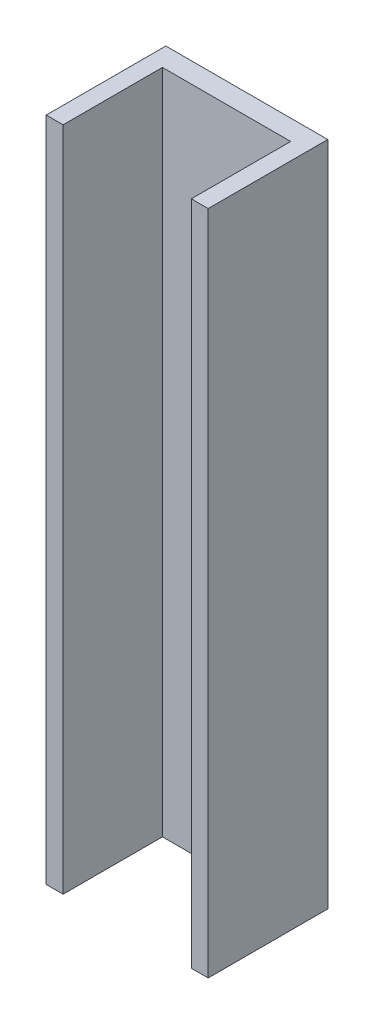
ISO-10303-21;
HEADER;
FILE_DESCRIPTION(('STEP AP214'),'2;1');
FILE_NAME('part.step','',(''),(''),'','','');
FILE_SCHEMA(('AUTOMOTIVE_DESIGN { 1 0 10303 214 1 1 1 1 }'));
ENDSEC;
DATA;
#1=APPLICATION_CONTEXT('core data for automotive mechanical design processes');
#2=APPLICATION_PROTOCOL_DEFINITION('international standard','automotive_design',2000,#1);
#3=PRODUCT_CONTEXT('',#1,'mechanical');
#4=PRODUCT('Part','Part','',(#3));
#5=PRODUCT_RELATED_PRODUCT_CATEGORY('part','',(#4));
#6=PRODUCT_DEFINITION_FORMATION('','',#4);
#7=PRODUCT_DEFINITION_CONTEXT('part definition',#1,'design');
#8=PRODUCT_DEFINITION('design','',#6,#7);
#9=PRODUCT_DEFINITION_SHAPE('','',#8);
#10=(LENGTH_UNIT() NAMED_UNIT(*) SI_UNIT(.MILLI.,.METRE.));
#11=(NAMED_UNIT(*) PLANE_ANGLE_UNIT() SI_UNIT($,.RADIAN.));
#12=(NAMED_UNIT(*) SI_UNIT($,.STERADIAN.) SOLID_ANGLE_UNIT());
#13=UNCERTAINTY_MEASURE_WITH_UNIT(LENGTH_MEASURE(1.E-05),#10,'distance_accuracy_value','');
#14=(GEOMETRIC_REPRESENTATION_CONTEXT(3) GLOBAL_UNCERTAINTY_ASSIGNED_CONTEXT((#13)) GLOBAL_UNIT_ASSIGNED_CONTEXT((#10,
#11,#12)) REPRESENTATION_CONTEXT('',''));
#15=CARTESIAN_POINT('',(0.,0.,0.));
#16=DIRECTION('',(0.,0.,1.));
#17=DIRECTION('',(1.,0.,0.));
#18=AXIS2_PLACEMENT_3D('',#15,#16,#17);
#19=CARTESIAN_POINT('',(3.8,39.5,5.89));
#20=DIRECTION('',(0.,0.,-1.));
#21=DIRECTION('',(-1.,0.,0.));
#22=AXIS2_PLACEMENT_3D('',#19,#20,#21);
#23=PLANE('',#22);
#24=DIRECTION('',(1.,0.,0.));
#25=VECTOR('',#24,1.);
#26=CARTESIAN_POINT('',(3.8,0.,5.89));
#27=LINE('',#26,#25);
#28=CARTESIAN_POINT('',(3.8,0.,5.89));
#29=VERTEX_POINT('',#28);
#30=CARTESIAN_POINT('',(4.8,0.,5.89));
#31=VERTEX_POINT('',#30);
#32=EDGE_CURVE('E147',#29,#31,#27,.T.);
#33=ORIENTED_EDGE('',*,*,#32,.T.);
#34=DIRECTION('',(0.,-1.,0.));
#35=VECTOR('',#34,1.);
#36=CARTESIAN_POINT('',(4.8,39.5,5.89));
#37=LINE('',#36,#35);
#38=CARTESIAN_POINT('',(4.8,39.5,5.89));
#39=VERTEX_POINT('',#38);
#40=EDGE_CURVE('E11',#39,#31,#37,.T.);
#41=ORIENTED_EDGE('',*,*,#40,.F.);
#42=DIRECTION('',(1.,0.,0.));
#43=VECTOR('',#42,1.);
#44=CARTESIAN_POINT('',(3.8,39.5,5.89));
#45=LINE('',#44,#43);
#46=CARTESIAN_POINT('',(3.8,39.5,5.89));
#47=VERTEX_POINT('',#46);
#48=EDGE_CURVE('E169',#47,#39,#45,.T.);
#49=ORIENTED_EDGE('',*,*,#48,.F.);
#50=DIRECTION('',(0.,-1.,0.));
#51=VECTOR('',#50,1.);
#52=CARTESIAN_POINT('',(3.8,39.5,5.89));
#53=LINE('',#52,#51);
#54=EDGE_CURVE('E143',#47,#29,#53,.T.);
#55=ORIENTED_EDGE('',*,*,#54,.T.);
#56=EDGE_LOOP('',(#33,#41,#49,#55));
#57=FACE_BOUND('',#56,.T.);
#58=ADVANCED_FACE('F45',(#57),#23,.F.);
#59=CARTESIAN_POINT('',(4.8,39.5,5.89));
#60=DIRECTION('',(-1.,0.,0.));
#61=DIRECTION('',(0.,0.,1.));
#62=AXIS2_PLACEMENT_3D('',#59,#60,#61);
#63=PLANE('',#62);
#64=DIRECTION('',(0.,0.,-1.));
#65=VECTOR('',#64,1.);
#66=CARTESIAN_POINT('',(4.8,0.,5.89));
#67=LINE('',#66,#65);
#68=CARTESIAN_POINT('',(4.8,0.,-1.2));
#69=VERTEX_POINT('',#68);
#70=EDGE_CURVE('E151',#31,#69,#67,.T.);
#71=ORIENTED_EDGE('',*,*,#70,.T.);
#72=DIRECTION('',(0.,-1.,0.));
#73=VECTOR('',#72,1.);
#74=CARTESIAN_POINT('',(4.8,39.5,-1.2));
#75=LINE('',#74,#73);
#76=CARTESIAN_POINT('',(4.8,39.5,-1.2));
#77=VERTEX_POINT('',#76);
#78=EDGE_CURVE('E55',#77,#69,#75,.T.);
#79=ORIENTED_EDGE('',*,*,#78,.F.);
#80=DIRECTION('',(0.,0.,-1.));
#81=VECTOR('',#80,1.);
#82=CARTESIAN_POINT('',(4.8,39.5,5.89));
#83=LINE('',#82,#81);
#84=EDGE_CURVE('E106',#39,#77,#83,.T.);
#85=ORIENTED_EDGE('',*,*,#84,.F.);
#86=ORIENTED_EDGE('',*,*,#40,.T.);
#87=EDGE_LOOP('',(#71,#79,#85,#86));
#88=FACE_BOUND('',#87,.T.);
#89=ADVANCED_FACE('F234',(#88),#63,.F.);
#90=CARTESIAN_POINT('',(4.8,39.5,-1.2));
#91=DIRECTION('',(0.,0.,1.));
#92=DIRECTION('',(1.,0.,0.));
#93=AXIS2_PLACEMENT_3D('',#90,#91,#92);
#94=PLANE('',#93);
#95=CARTESIAN_POINT('',(0.,19.75,-1.2));
#96=DIRECTION('',(0.,0.,-1.));
#97=DIRECTION('',(-1.,0.,0.));
#98=AXIS2_PLACEMENT_3D('',#95,#96,#97);
#99=CIRCLE('',#98,1.3375);
#100=CARTESIAN_POINT('',(-1.3375,19.75,-1.2));
#101=VERTEX_POINT('',#100);
#102=EDGE_CURVE('E214',#101,#101,#99,.T.);
#103=ORIENTED_EDGE('',*,*,#102,.F.);
#104=EDGE_LOOP('',(#103));
#105=FACE_BOUND('',#104,.T.);
#106=DIRECTION('',(-1.,0.,0.));
#107=VECTOR('',#106,1.);
#108=CARTESIAN_POINT('',(4.8,0.,-1.2));
#109=LINE('',#108,#107);
#110=CARTESIAN_POINT('',(-4.8,0.,-1.2));
#111=VERTEX_POINT('',#110);
#112=EDGE_CURVE('E154',#69,#111,#109,.T.);
#113=ORIENTED_EDGE('',*,*,#112,.T.);
#114=DIRECTION('',(0.,-1.,0.));
#115=VECTOR('',#114,1.);
#116=CARTESIAN_POINT('',(-4.8,39.5,-1.2));
#117=LINE('',#116,#115);
#118=CARTESIAN_POINT('',(-4.8,39.5,-1.2));
#119=VERTEX_POINT('',#118);
#120=EDGE_CURVE('E180',#119,#111,#117,.T.);
#121=ORIENTED_EDGE('',*,*,#120,.F.);
#122=DIRECTION('',(-1.,0.,0.));
#123=VECTOR('',#122,1.);
#124=CARTESIAN_POINT('',(4.8,39.5,-1.2));
#125=LINE('',#124,#123);
#126=EDGE_CURVE('E191',#77,#119,#125,.T.);
#127=ORIENTED_EDGE('',*,*,#126,.F.);
#128=ORIENTED_EDGE('',*,*,#78,.T.);
#129=EDGE_LOOP('',(#113,#121,#127,#128));
#130=FACE_BOUND('',#129,.T.);
#131=ADVANCED_FACE('F189',(#105,#130),#94,.F.);
#132=CARTESIAN_POINT('',(-4.8,39.5,-1.2));
#133=DIRECTION('',(1.,0.,0.));
#134=DIRECTION('',(0.,0.,-1.));
#135=AXIS2_PLACEMENT_3D('',#132,#133,#134);
#136=PLANE('',#135);
#137=DIRECTION('',(0.,0.,1.));
#138=VECTOR('',#137,1.);
#139=CARTESIAN_POINT('',(-4.8,0.,-1.2));
#140=LINE('',#139,#138);
#141=CARTESIAN_POINT('',(-4.8,0.,5.89));
#142=VERTEX_POINT('',#141);
#143=EDGE_CURVE('E157',#111,#142,#140,.T.);
#144=ORIENTED_EDGE('',*,*,#143,.T.);
#145=DIRECTION('',(0.,-1.,0.));
#146=VECTOR('',#145,1.);
#147=CARTESIAN_POINT('',(-4.8,39.5,5.89));
#148=LINE('',#147,#146);
#149=CARTESIAN_POINT('',(-4.8,39.5,5.89));
#150=VERTEX_POINT('',#149);
#151=EDGE_CURVE('E176',#150,#142,#148,.T.);
#152=ORIENTED_EDGE('',*,*,#151,.F.);
#153=DIRECTION('',(0.,0.,1.));
#154=VECTOR('',#153,1.);
#155=CARTESIAN_POINT('',(-4.8,39.5,-1.2));
#156=LINE('',#155,#154);
#157=EDGE_CURVE('E204',#119,#150,#156,.T.);
#158=ORIENTED_EDGE('',*,*,#157,.F.);
#159=ORIENTED_EDGE('',*,*,#120,.T.);
#160=EDGE_LOOP('',(#144,#152,#158,#159));
#161=FACE_BOUND('',#160,.T.);
#162=ADVANCED_FACE('F199',(#161),#136,.F.);
#163=CARTESIAN_POINT('',(-4.8,39.5,5.89));
#164=DIRECTION('',(0.,0.,-1.));
#165=DIRECTION('',(-1.,0.,0.));
#166=AXIS2_PLACEMENT_3D('',#163,#164,#165);
#167=PLANE('',#166);
#168=DIRECTION('',(1.,0.,0.));
#169=VECTOR('',#168,1.);
#170=CARTESIAN_POINT('',(-4.8,0.,5.89));
#171=LINE('',#170,#169);
#172=CARTESIAN_POINT('',(-3.8,0.,5.89));
#173=VERTEX_POINT('',#172);
#174=EDGE_CURVE('E160',#142,#173,#171,.T.);
#175=ORIENTED_EDGE('',*,*,#174,.T.);
#176=DIRECTION('',(0.,-1.,0.));
#177=VECTOR('',#176,1.);
#178=CARTESIAN_POINT('',(-3.8,39.5,5.89));
#179=LINE('',#178,#177);
#180=CARTESIAN_POINT('',(-3.8,39.5,5.89));
#181=VERTEX_POINT('',#180);
#182=EDGE_CURVE('E136',#181,#173,#179,.T.);
#183=ORIENTED_EDGE('',*,*,#182,.F.);
#184=DIRECTION('',(1.,0.,0.));
#185=VECTOR('',#184,1.);
#186=CARTESIAN_POINT('',(-4.8,39.5,5.89));
#187=LINE('',#186,#185);
#188=EDGE_CURVE('E125',#150,#181,#187,.T.);
#189=ORIENTED_EDGE('',*,*,#188,.F.);
#190=ORIENTED_EDGE('',*,*,#151,.T.);
#191=EDGE_LOOP('',(#175,#183,#189,#190));
#192=FACE_BOUND('',#191,.T.);
#193=ADVANCED_FACE('F202',(#192),#167,.F.);
#194=CARTESIAN_POINT('',(-3.8,39.5,0.));
#195=DIRECTION('',(-1.,0.,0.));
#196=DIRECTION('',(0.,0.,1.));
#197=AXIS2_PLACEMENT_3D('',#194,#195,#196);
#198=PLANE('',#197);
#199=DIRECTION('',(0.,0.,-1.));
#200=VECTOR('',#199,1.);
#201=CARTESIAN_POINT('',(-3.8,0.,0.));
#202=LINE('',#201,#200);
#203=CARTESIAN_POINT('',(-3.8,0.,0.));
#204=VERTEX_POINT('',#203);
#205=EDGE_CURVE('E134',#173,#204,#202,.T.);
#206=ORIENTED_EDGE('',*,*,#205,.T.);
#207=DIRECTION('',(0.,-1.,0.));
#208=VECTOR('',#207,1.);
#209=CARTESIAN_POINT('',(-3.8,39.5,0.));
#210=LINE('',#209,#208);
#211=CARTESIAN_POINT('',(-3.8,39.5,0.));
#212=VERTEX_POINT('',#211);
#213=EDGE_CURVE('E131',#212,#204,#210,.T.);
#214=ORIENTED_EDGE('',*,*,#213,.F.);
#215=DIRECTION('',(0.,0.,-1.));
#216=VECTOR('',#215,1.);
#217=CARTESIAN_POINT('',(-3.8,39.5,0.));
#218=LINE('',#217,#216);
#219=EDGE_CURVE('E119',#181,#212,#218,.T.);
#220=ORIENTED_EDGE('',*,*,#219,.F.);
#221=ORIENTED_EDGE('',*,*,#182,.T.);
#222=EDGE_LOOP('',(#206,#214,#220,#221));
#223=FACE_BOUND('',#222,.T.);
#224=ADVANCED_FACE('F132',(#223),#198,.F.);
#225=CARTESIAN_POINT('',(-3.8,39.5,0.));
#226=DIRECTION('',(0.,0.,-1.));
#227=DIRECTION('',(-1.,0.,0.));
#228=AXIS2_PLACEMENT_3D('',#225,#226,#227);
#229=PLANE('',#228);
#230=CARTESIAN_POINT('',(0.,19.75,0.));
#231=DIRECTION('',(0.,0.,-1.));
#232=DIRECTION('',(-1.,0.,0.));
#233=AXIS2_PLACEMENT_3D('',#230,#231,#232);
#234=CIRCLE('',#233,1.3375);
#235=CARTESIAN_POINT('',(-1.3375,19.75,0.));
#236=VERTEX_POINT('',#235);
#237=EDGE_CURVE('E48',#236,#236,#234,.T.);
#238=ORIENTED_EDGE('',*,*,#237,.T.);
#239=EDGE_LOOP('',(#238));
#240=FACE_BOUND('',#239,.T.);
#241=DIRECTION('',(1.,0.,0.));
#242=VECTOR('',#241,1.);
#243=CARTESIAN_POINT('',(-3.8,0.,0.));
#244=LINE('',#243,#242);
#245=CARTESIAN_POINT('',(3.8,0.,0.));
#246=VERTEX_POINT('',#245);
#247=EDGE_CURVE('E92',#204,#246,#244,.T.);
#248=ORIENTED_EDGE('',*,*,#247,.T.);
#249=DIRECTION('',(0.,-1.,0.));
#250=VECTOR('',#249,1.);
#251=CARTESIAN_POINT('',(3.8,39.5,0.));
#252=LINE('',#251,#250);
#253=CARTESIAN_POINT('',(3.8,39.5,0.));
#254=VERTEX_POINT('',#253);
#255=EDGE_CURVE('E137',#254,#246,#252,.T.);
#256=ORIENTED_EDGE('',*,*,#255,.F.);
#257=DIRECTION('',(1.,0.,0.));
#258=VECTOR('',#257,1.);
#259=CARTESIAN_POINT('',(-3.8,39.5,0.));
#260=LINE('',#259,#258);
#261=EDGE_CURVE('E123',#212,#254,#260,.T.);
#262=ORIENTED_EDGE('',*,*,#261,.F.);
#263=ORIENTED_EDGE('',*,*,#213,.T.);
#264=EDGE_LOOP('',(#248,#256,#262,#263));
#265=FACE_BOUND('',#264,.T.);
#266=ADVANCED_FACE('F139',(#240,#265),#229,.F.);
#267=CARTESIAN_POINT('',(3.8,39.5,0.));
#268=DIRECTION('',(1.,0.,0.));
#269=DIRECTION('',(0.,0.,-1.));
#270=AXIS2_PLACEMENT_3D('',#267,#268,#269);
#271=PLANE('',#270);
#272=DIRECTION('',(0.,0.,1.));
#273=VECTOR('',#272,1.);
#274=CARTESIAN_POINT('',(3.8,0.,0.));
#275=LINE('',#274,#273);
#276=EDGE_CURVE('E98',#246,#29,#275,.T.);
#277=ORIENTED_EDGE('',*,*,#276,.T.);
#278=ORIENTED_EDGE('',*,*,#54,.F.);
#279=DIRECTION('',(0.,0.,1.));
#280=VECTOR('',#279,1.);
#281=CARTESIAN_POINT('',(3.8,39.5,0.));
#282=LINE('',#281,#280);
#283=EDGE_CURVE('E63',#254,#47,#282,.T.);
#284=ORIENTED_EDGE('',*,*,#283,.F.);
#285=ORIENTED_EDGE('',*,*,#255,.T.);
#286=EDGE_LOOP('',(#277,#278,#284,#285));
#287=FACE_BOUND('',#286,.T.);
#288=ADVANCED_FACE('F241',(#287),#271,.F.);
#289=CARTESIAN_POINT('',(0.,39.5,0.));
#290=DIRECTION('',(0.,1.,0.));
#291=DIRECTION('',(0.,0.,1.));
#292=AXIS2_PLACEMENT_3D('',#289,#290,#291);
#293=PLANE('',#292);
#294=ORIENTED_EDGE('',*,*,#48,.T.);
#295=ORIENTED_EDGE('',*,*,#84,.T.);
#296=ORIENTED_EDGE('',*,*,#126,.T.);
#297=ORIENTED_EDGE('',*,*,#157,.T.);
#298=ORIENTED_EDGE('',*,*,#188,.T.);
#299=ORIENTED_EDGE('',*,*,#219,.T.);
#300=ORIENTED_EDGE('',*,*,#261,.T.);
#301=ORIENTED_EDGE('',*,*,#283,.T.);
#302=EDGE_LOOP('',(#294,#295,#296,#297,#298,#299,#300,#301));
#303=FACE_BOUND('',#302,.T.);
#304=ADVANCED_FACE('F121',(#303),#293,.T.);
#305=CARTESIAN_POINT('',(0.,0.,0.));
#306=DIRECTION('',(0.,1.,0.));
#307=DIRECTION('',(0.,0.,1.));
#308=AXIS2_PLACEMENT_3D('',#305,#306,#307);
#309=PLANE('',#308);
#310=ORIENTED_EDGE('',*,*,#32,.F.);
#311=ORIENTED_EDGE('',*,*,#276,.F.);
#312=ORIENTED_EDGE('',*,*,#247,.F.);
#313=ORIENTED_EDGE('',*,*,#205,.F.);
#314=ORIENTED_EDGE('',*,*,#174,.F.);
#315=ORIENTED_EDGE('',*,*,#143,.F.);
#316=ORIENTED_EDGE('',*,*,#112,.F.);
#317=ORIENTED_EDGE('',*,*,#70,.F.);
#318=EDGE_LOOP('',(#310,#311,#312,#313,#314,#315,#316,#317));
#319=FACE_BOUND('',#318,.T.);
#320=ADVANCED_FACE('F195',(#319),#309,.F.);
#321=CARTESIAN_POINT('',(0.,19.75,38.9));
#322=DIRECTION('',(0.,0.,-1.));
#323=DIRECTION('',(-1.,0.,0.));
#324=AXIS2_PLACEMENT_3D('',#321,#322,#323);
#325=CYLINDRICAL_SURFACE('',#324,1.3375);
#326=ORIENTED_EDGE('',*,*,#102,.T.);
#327=EDGE_LOOP('',(#326));
#328=FACE_BOUND('',#327,.T.);
#329=ORIENTED_EDGE('',*,*,#237,.F.);
#330=EDGE_LOOP('',(#329));
#331=FACE_BOUND('',#330,.T.);
#332=ADVANCED_FACE('F224',(#328,#331),#325,.F.);
#333=CLOSED_SHELL('',(#58,#89,#131,#162,#193,#224,#266,#288,#304,#320,#332));
#334=MANIFOLD_SOLID_BREP('B2',#333);
#335=ADVANCED_BREP_SHAPE_REPRESENTATION('',(#18,#334),#14);
#336=SHAPE_DEFINITION_REPRESENTATION(#9,#335);
ENDSEC;
END-ISO-10303-21;
